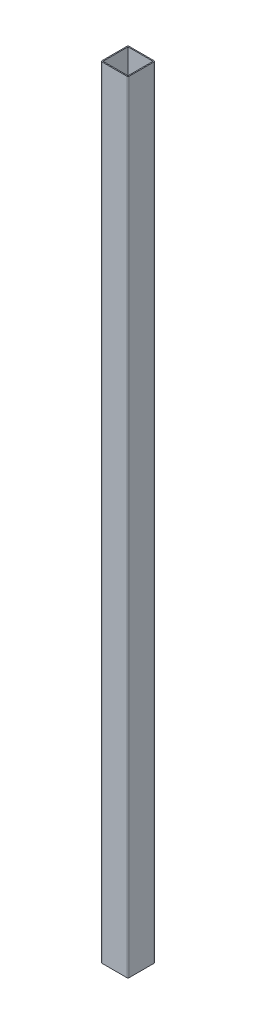
ISO-10303-21;
HEADER;
FILE_DESCRIPTION(('STEP AP214'),'2;1');
FILE_NAME('part.step','',(''),(''),'','','');
FILE_SCHEMA(('AUTOMOTIVE_DESIGN { 1 0 10303 214 1 1 1 1 }'));
ENDSEC;
DATA;
#1=APPLICATION_CONTEXT('core data for automotive mechanical design processes');
#2=APPLICATION_PROTOCOL_DEFINITION('international standard','automotive_design',2000,#1);
#3=PRODUCT_CONTEXT('',#1,'mechanical');
#4=PRODUCT('Part','Part','',(#3));
#5=PRODUCT_RELATED_PRODUCT_CATEGORY('part','',(#4));
#6=PRODUCT_DEFINITION_FORMATION('','',#4);
#7=PRODUCT_DEFINITION_CONTEXT('part definition',#1,'design');
#8=PRODUCT_DEFINITION('design','',#6,#7);
#9=PRODUCT_DEFINITION_SHAPE('','',#8);
#10=(LENGTH_UNIT() NAMED_UNIT(*) SI_UNIT(.MILLI.,.METRE.));
#11=(NAMED_UNIT(*) PLANE_ANGLE_UNIT() SI_UNIT($,.RADIAN.));
#12=(NAMED_UNIT(*) SI_UNIT($,.STERADIAN.) SOLID_ANGLE_UNIT());
#13=UNCERTAINTY_MEASURE_WITH_UNIT(LENGTH_MEASURE(1.E-05),#10,'distance_accuracy_value','');
#14=(GEOMETRIC_REPRESENTATION_CONTEXT(3) GLOBAL_UNCERTAINTY_ASSIGNED_CONTEXT((#13)) GLOBAL_UNIT_ASSIGNED_CONTEXT((#10,
#11,#12)) REPRESENTATION_CONTEXT('',''));
#15=CARTESIAN_POINT('',(0.,0.,0.));
#16=DIRECTION('',(0.,0.,1.));
#17=DIRECTION('',(1.,0.,0.));
#18=AXIS2_PLACEMENT_3D('',#15,#16,#17);
#19=CARTESIAN_POINT('',(73.9990000000006,-4614.,73.999));
#20=DIRECTION('',(0.,1.,0.));
#21=DIRECTION('',(-1.,0.,0.));
#22=AXIS2_PLACEMENT_3D('',#19,#20,#21);
#23=CYLINDRICAL_SURFACE('',#22,6.00100000000001);
#24=CARTESIAN_POINT('',(73.999,0.,73.999));
#25=DIRECTION('',(0.,-1.,0.));
#26=DIRECTION('',(1.,0.,0.));
#27=AXIS2_PLACEMENT_3D('',#24,#25,#26);
#28=CIRCLE('',#27,6.00100000000001);
#29=CARTESIAN_POINT('',(80.,0.,73.999));
#30=VERTEX_POINT('',#29);
#31=CARTESIAN_POINT('',(73.999,0.,80.));
#32=VERTEX_POINT('',#31);
#33=EDGE_CURVE('E232',#30,#32,#28,.T.);
#34=ORIENTED_EDGE('',*,*,#33,.T.);
#35=DIRECTION('',(0.,1.,0.));
#36=VECTOR('',#35,1.);
#37=CARTESIAN_POINT('',(73.9990000000006,-4614.,80.));
#38=LINE('',#37,#36);
#39=CARTESIAN_POINT('',(73.9990000000006,-4614.,80.));
#40=VERTEX_POINT('',#39);
#41=EDGE_CURVE('E12',#40,#32,#38,.T.);
#42=ORIENTED_EDGE('',*,*,#41,.F.);
#43=CARTESIAN_POINT('',(73.9990000000006,-4614.,73.999));
#44=DIRECTION('',(0.,-1.,0.));
#45=DIRECTION('',(1.,0.,0.));
#46=AXIS2_PLACEMENT_3D('',#43,#44,#45);
#47=CIRCLE('',#46,6.00100000000001);
#48=CARTESIAN_POINT('',(80.0000000000006,-4614.,73.999));
#49=VERTEX_POINT('',#48);
#50=EDGE_CURVE('E310',#49,#40,#47,.T.);
#51=ORIENTED_EDGE('',*,*,#50,.F.);
#52=DIRECTION('',(0.,1.,0.));
#53=VECTOR('',#52,1.);
#54=CARTESIAN_POINT('',(80.0000000000006,-4614.,73.999));
#55=LINE('',#54,#53);
#56=EDGE_CURVE('E247',#49,#30,#55,.T.);
#57=ORIENTED_EDGE('',*,*,#56,.T.);
#58=EDGE_LOOP('',(#34,#42,#51,#57));
#59=FACE_BOUND('',#58,.T.);
#60=ADVANCED_FACE('F60',(#59),#23,.T.);
#61=CARTESIAN_POINT('',(73.9990000000006,-4614.,80.));
#62=DIRECTION('',(0.,0.,-1.));
#63=DIRECTION('',(-1.,0.,0.));
#64=AXIS2_PLACEMENT_3D('',#61,#62,#63);
#65=PLANE('',#64);
#66=DIRECTION('',(-1.,0.,0.));
#67=VECTOR('',#66,1.);
#68=CARTESIAN_POINT('',(73.999,0.,80.));
#69=LINE('',#68,#67);
#70=CARTESIAN_POINT('',(-73.999,0.,80.));
#71=VERTEX_POINT('',#70);
#72=EDGE_CURVE('E235',#32,#71,#69,.T.);
#73=ORIENTED_EDGE('',*,*,#72,.T.);
#74=DIRECTION('',(0.,1.,0.));
#75=VECTOR('',#74,1.);
#76=CARTESIAN_POINT('',(-73.9989999999995,-4614.,80.));
#77=LINE('',#76,#75);
#78=CARTESIAN_POINT('',(-73.9989999999995,-4614.,80.));
#79=VERTEX_POINT('',#78);
#80=EDGE_CURVE('E70',#79,#71,#77,.T.);
#81=ORIENTED_EDGE('',*,*,#80,.F.);
#82=DIRECTION('',(-1.,0.,0.));
#83=VECTOR('',#82,1.);
#84=CARTESIAN_POINT('',(73.9990000000006,-4614.,80.));
#85=LINE('',#84,#83);
#86=EDGE_CURVE('E312',#40,#79,#85,.T.);
#87=ORIENTED_EDGE('',*,*,#86,.F.);
#88=ORIENTED_EDGE('',*,*,#41,.T.);
#89=EDGE_LOOP('',(#73,#81,#87,#88));
#90=FACE_BOUND('',#89,.T.);
#91=ADVANCED_FACE('F347',(#90),#65,.F.);
#92=CARTESIAN_POINT('',(-73.9989999999994,-4614.,73.999));
#93=DIRECTION('',(0.,1.,0.));
#94=DIRECTION('',(-1.,0.,0.));
#95=AXIS2_PLACEMENT_3D('',#92,#93,#94);
#96=CYLINDRICAL_SURFACE('',#95,6.00100000000001);
#97=CARTESIAN_POINT('',(-73.999,0.,73.999));
#98=DIRECTION('',(0.,-1.,0.));
#99=DIRECTION('',(1.,0.,0.));
#100=AXIS2_PLACEMENT_3D('',#97,#98,#99);
#101=CIRCLE('',#100,6.00100000000001);
#102=CARTESIAN_POINT('',(-80.,0.,73.999));
#103=VERTEX_POINT('',#102);
#104=EDGE_CURVE('E237',#71,#103,#101,.T.);
#105=ORIENTED_EDGE('',*,*,#104,.T.);
#106=DIRECTION('',(0.,1.,0.));
#107=VECTOR('',#106,1.);
#108=CARTESIAN_POINT('',(-79.9999999999994,-4614.,73.999));
#109=LINE('',#108,#107);
#110=CARTESIAN_POINT('',(-79.9999999999994,-4614.,73.999));
#111=VERTEX_POINT('',#110);
#112=EDGE_CURVE('E254',#111,#103,#109,.T.);
#113=ORIENTED_EDGE('',*,*,#112,.F.);
#114=CARTESIAN_POINT('',(-73.9989999999994,-4614.,73.999));
#115=DIRECTION('',(0.,-1.,0.));
#116=DIRECTION('',(1.,0.,0.));
#117=AXIS2_PLACEMENT_3D('',#114,#115,#116);
#118=CIRCLE('',#117,6.00100000000001);
#119=EDGE_CURVE('E314',#79,#111,#118,.T.);
#120=ORIENTED_EDGE('',*,*,#119,.F.);
#121=ORIENTED_EDGE('',*,*,#80,.T.);
#122=EDGE_LOOP('',(#105,#113,#120,#121));
#123=FACE_BOUND('',#122,.T.);
#124=ADVANCED_FACE('F352',(#123),#96,.T.);
#125=CARTESIAN_POINT('',(-79.9999999999994,-4614.,-73.999));
#126=DIRECTION('',(1.,0.,0.));
#127=DIRECTION('',(0.,1.,0.));
#128=AXIS2_PLACEMENT_3D('',#125,#126,#127);
#129=PLANE('',#128);
#130=DIRECTION('',(0.,0.,-1.));
#131=VECTOR('',#130,1.);
#132=CARTESIAN_POINT('',(-80.,0.,-73.999));
#133=LINE('',#132,#131);
#134=CARTESIAN_POINT('',(-80.,0.,-73.999));
#135=VERTEX_POINT('',#134);
#136=EDGE_CURVE('E239',#103,#135,#133,.T.);
#137=ORIENTED_EDGE('',*,*,#136,.T.);
#138=DIRECTION('',(0.,1.,0.));
#139=VECTOR('',#138,1.);
#140=CARTESIAN_POINT('',(-79.9999999999994,-4614.,-73.999));
#141=LINE('',#140,#139);
#142=CARTESIAN_POINT('',(-79.9999999999994,-4614.,-73.999));
#143=VERTEX_POINT('',#142);
#144=EDGE_CURVE('E251',#143,#135,#141,.T.);
#145=ORIENTED_EDGE('',*,*,#144,.F.);
#146=DIRECTION('',(0.,0.,-1.));
#147=VECTOR('',#146,1.);
#148=CARTESIAN_POINT('',(-79.9999999999994,-4614.,-73.999));
#149=LINE('',#148,#147);
#150=EDGE_CURVE('E316',#111,#143,#149,.T.);
#151=ORIENTED_EDGE('',*,*,#150,.F.);
#152=ORIENTED_EDGE('',*,*,#112,.T.);
#153=EDGE_LOOP('',(#137,#145,#151,#152));
#154=FACE_BOUND('',#153,.T.);
#155=ADVANCED_FACE('F322',(#154),#129,.F.);
#156=CARTESIAN_POINT('',(-73.9989999999994,-4614.,-73.999));
#157=DIRECTION('',(0.,1.,0.));
#158=DIRECTION('',(-1.,0.,0.));
#159=AXIS2_PLACEMENT_3D('',#156,#157,#158);
#160=CYLINDRICAL_SURFACE('',#159,6.001);
#161=CARTESIAN_POINT('',(-73.999,0.,-73.999));
#162=DIRECTION('',(0.,-1.,0.));
#163=DIRECTION('',(1.,0.,0.));
#164=AXIS2_PLACEMENT_3D('',#161,#162,#163);
#165=CIRCLE('',#164,6.001);
#166=CARTESIAN_POINT('',(-73.999,0.,-80.));
#167=VERTEX_POINT('',#166);
#168=EDGE_CURVE('E241',#135,#167,#165,.T.);
#169=ORIENTED_EDGE('',*,*,#168,.T.);
#170=DIRECTION('',(0.,1.,0.));
#171=VECTOR('',#170,1.);
#172=CARTESIAN_POINT('',(-73.9989999999995,-4614.,-80.));
#173=LINE('',#172,#171);
#174=CARTESIAN_POINT('',(-73.9989999999995,-4614.,-80.));
#175=VERTEX_POINT('',#174);
#176=EDGE_CURVE('E199',#175,#167,#173,.T.);
#177=ORIENTED_EDGE('',*,*,#176,.F.);
#178=CARTESIAN_POINT('',(-73.9989999999994,-4614.,-73.999));
#179=DIRECTION('',(0.,-1.,0.));
#180=DIRECTION('',(1.,0.,0.));
#181=AXIS2_PLACEMENT_3D('',#178,#179,#180);
#182=CIRCLE('',#181,6.001);
#183=EDGE_CURVE('E190',#143,#175,#182,.T.);
#184=ORIENTED_EDGE('',*,*,#183,.F.);
#185=ORIENTED_EDGE('',*,*,#144,.T.);
#186=EDGE_LOOP('',(#169,#177,#184,#185));
#187=FACE_BOUND('',#186,.T.);
#188=ADVANCED_FACE('F326',(#187),#160,.T.);
#189=CARTESIAN_POINT('',(-73.9989999999995,-4614.,-80.));
#190=DIRECTION('',(0.,0.,1.));
#191=DIRECTION('',(1.,0.,0.));
#192=AXIS2_PLACEMENT_3D('',#189,#190,#191);
#193=PLANE('',#192);
#194=DIRECTION('',(1.,0.,0.));
#195=VECTOR('',#194,1.);
#196=CARTESIAN_POINT('',(-73.999,0.,-80.));
#197=LINE('',#196,#195);
#198=CARTESIAN_POINT('',(73.999,0.,-80.));
#199=VERTEX_POINT('',#198);
#200=EDGE_CURVE('E198',#167,#199,#197,.T.);
#201=ORIENTED_EDGE('',*,*,#200,.T.);
#202=DIRECTION('',(0.,1.,0.));
#203=VECTOR('',#202,1.);
#204=CARTESIAN_POINT('',(73.9990000000006,-4614.,-80.));
#205=LINE('',#204,#203);
#206=CARTESIAN_POINT('',(73.9990000000006,-4614.,-80.));
#207=VERTEX_POINT('',#206);
#208=EDGE_CURVE('E195',#207,#199,#205,.T.);
#209=ORIENTED_EDGE('',*,*,#208,.F.);
#210=DIRECTION('',(1.,0.,0.));
#211=VECTOR('',#210,1.);
#212=CARTESIAN_POINT('',(-73.9989999999995,-4614.,-80.));
#213=LINE('',#212,#211);
#214=EDGE_CURVE('E184',#175,#207,#213,.T.);
#215=ORIENTED_EDGE('',*,*,#214,.F.);
#216=ORIENTED_EDGE('',*,*,#176,.T.);
#217=EDGE_LOOP('',(#201,#209,#215,#216));
#218=FACE_BOUND('',#217,.T.);
#219=ADVANCED_FACE('F196',(#218),#193,.F.);
#220=CARTESIAN_POINT('',(73.9990000000006,-4614.,-73.999));
#221=DIRECTION('',(0.,1.,0.));
#222=DIRECTION('',(-1.,0.,0.));
#223=AXIS2_PLACEMENT_3D('',#220,#221,#222);
#224=CYLINDRICAL_SURFACE('',#223,6.001);
#225=CARTESIAN_POINT('',(73.999,0.,-73.999));
#226=DIRECTION('',(0.,-1.,0.));
#227=DIRECTION('',(1.,0.,0.));
#228=AXIS2_PLACEMENT_3D('',#225,#226,#227);
#229=CIRCLE('',#228,6.001);
#230=CARTESIAN_POINT('',(80.,0.,-73.999));
#231=VERTEX_POINT('',#230);
#232=EDGE_CURVE('E132',#199,#231,#229,.T.);
#233=ORIENTED_EDGE('',*,*,#232,.T.);
#234=DIRECTION('',(0.,1.,0.));
#235=VECTOR('',#234,1.);
#236=CARTESIAN_POINT('',(80.0000000000006,-4614.,-73.999));
#237=LINE('',#236,#235);
#238=CARTESIAN_POINT('',(80.0000000000006,-4614.,-73.999));
#239=VERTEX_POINT('',#238);
#240=EDGE_CURVE('E200',#239,#231,#237,.T.);
#241=ORIENTED_EDGE('',*,*,#240,.F.);
#242=CARTESIAN_POINT('',(73.9990000000006,-4614.,-73.999));
#243=DIRECTION('',(0.,-1.,0.));
#244=DIRECTION('',(1.,0.,0.));
#245=AXIS2_PLACEMENT_3D('',#242,#243,#244);
#246=CIRCLE('',#245,6.001);
#247=EDGE_CURVE('E188',#207,#239,#246,.T.);
#248=ORIENTED_EDGE('',*,*,#247,.F.);
#249=ORIENTED_EDGE('',*,*,#208,.T.);
#250=EDGE_LOOP('',(#233,#241,#248,#249));
#251=FACE_BOUND('',#250,.T.);
#252=ADVANCED_FACE('F202',(#251),#224,.T.);
#253=CARTESIAN_POINT('',(-73.9989999999994,-4614.,73.999));
#254=DIRECTION('',(0.,1.,0.));
#255=DIRECTION('',(-1.,0.,0.));
#256=AXIS2_PLACEMENT_3D('',#253,#254,#255);
#257=CYLINDRICAL_SURFACE('',#256,0.000999999999987122);
#258=CARTESIAN_POINT('',(-73.999,0.,73.999));
#259=DIRECTION('',(0.,-1.,0.));
#260=DIRECTION('',(1.,0.,0.));
#261=AXIS2_PLACEMENT_3D('',#258,#259,#260);
#262=CIRCLE('',#261,0.000999999999987122);
#263=CARTESIAN_POINT('',(-73.999,0.,74.));
#264=VERTEX_POINT('',#263);
#265=CARTESIAN_POINT('',(-74.,0.,73.999));
#266=VERTEX_POINT('',#265);
#267=EDGE_CURVE('E208',#264,#266,#262,.T.);
#268=ORIENTED_EDGE('',*,*,#267,.F.);
#269=DIRECTION('',(0.,1.,0.));
#270=VECTOR('',#269,1.);
#271=CARTESIAN_POINT('',(-73.9989999999994,-4614.,74.));
#272=LINE('',#271,#270);
#273=CARTESIAN_POINT('',(-73.9989999999994,-4614.,74.));
#274=VERTEX_POINT('',#273);
#275=EDGE_CURVE('E64',#274,#264,#272,.T.);
#276=ORIENTED_EDGE('',*,*,#275,.F.);
#277=CARTESIAN_POINT('',(-73.9989999999994,-4614.,73.999));
#278=DIRECTION('',(0.,-1.,0.));
#279=DIRECTION('',(1.,0.,0.));
#280=AXIS2_PLACEMENT_3D('',#277,#278,#279);
#281=CIRCLE('',#280,0.000999999999987122);
#282=CARTESIAN_POINT('',(-73.9999999999994,-4614.,73.999));
#283=VERTEX_POINT('',#282);
#284=EDGE_CURVE('E246',#274,#283,#281,.T.);
#285=ORIENTED_EDGE('',*,*,#284,.T.);
#286=DIRECTION('',(0.,1.,0.));
#287=VECTOR('',#286,1.);
#288=CARTESIAN_POINT('',(-73.9999999999994,-4614.,73.999));
#289=LINE('',#288,#287);
#290=EDGE_CURVE('E204',#283,#266,#289,.T.);
#291=ORIENTED_EDGE('',*,*,#290,.T.);
#292=EDGE_LOOP('',(#268,#276,#285,#291));
#293=FACE_BOUND('',#292,.T.);
#294=ADVANCED_FACE('F62',(#293),#257,.F.);
#295=CARTESIAN_POINT('',(73.9990000000006,-4614.,74.));
#296=DIRECTION('',(0.,0.,-1.));
#297=DIRECTION('',(-1.,0.,0.));
#298=AXIS2_PLACEMENT_3D('',#295,#296,#297);
#299=PLANE('',#298);
#300=DIRECTION('',(-1.,0.,0.));
#301=VECTOR('',#300,1.);
#302=CARTESIAN_POINT('',(73.999,0.,74.));
#303=LINE('',#302,#301);
#304=CARTESIAN_POINT('',(73.999,0.,74.));
#305=VERTEX_POINT('',#304);
#306=EDGE_CURVE('E211',#305,#264,#303,.T.);
#307=ORIENTED_EDGE('',*,*,#306,.F.);
#308=DIRECTION('',(0.,1.,0.));
#309=VECTOR('',#308,1.);
#310=CARTESIAN_POINT('',(73.9990000000006,-4614.,74.));
#311=LINE('',#310,#309);
#312=CARTESIAN_POINT('',(73.9990000000006,-4614.,74.));
#313=VERTEX_POINT('',#312);
#314=EDGE_CURVE('E269',#313,#305,#311,.T.);
#315=ORIENTED_EDGE('',*,*,#314,.F.);
#316=DIRECTION('',(-1.,0.,0.));
#317=VECTOR('',#316,1.);
#318=CARTESIAN_POINT('',(73.9990000000006,-4614.,74.));
#319=LINE('',#318,#317);
#320=EDGE_CURVE('E278',#313,#274,#319,.T.);
#321=ORIENTED_EDGE('',*,*,#320,.T.);
#322=ORIENTED_EDGE('',*,*,#275,.T.);
#323=EDGE_LOOP('',(#307,#315,#321,#322));
#324=FACE_BOUND('',#323,.T.);
#325=ADVANCED_FACE('F276',(#324),#299,.T.);
#326=CARTESIAN_POINT('',(73.9990000000006,-4614.,73.999));
#327=DIRECTION('',(0.,1.,0.));
#328=DIRECTION('',(-1.,0.,0.));
#329=AXIS2_PLACEMENT_3D('',#326,#327,#328);
#330=CYLINDRICAL_SURFACE('',#329,0.000999999999987122);
#331=CARTESIAN_POINT('',(73.999,0.,73.999));
#332=DIRECTION('',(0.,-1.,0.));
#333=DIRECTION('',(1.,0.,0.));
#334=AXIS2_PLACEMENT_3D('',#331,#332,#333);
#335=CIRCLE('',#334,0.000999999999987122);
#336=CARTESIAN_POINT('',(74.,0.,73.999));
#337=VERTEX_POINT('',#336);
#338=EDGE_CURVE('E214',#337,#305,#335,.T.);
#339=ORIENTED_EDGE('',*,*,#338,.F.);
#340=DIRECTION('',(0.,1.,0.));
#341=VECTOR('',#340,1.);
#342=CARTESIAN_POINT('',(74.0000000000006,-4614.,73.999));
#343=LINE('',#342,#341);
#344=CARTESIAN_POINT('',(74.0000000000006,-4614.,73.999));
#345=VERTEX_POINT('',#344);
#346=EDGE_CURVE('E268',#345,#337,#343,.T.);
#347=ORIENTED_EDGE('',*,*,#346,.F.);
#348=CARTESIAN_POINT('',(73.9990000000006,-4614.,73.999));
#349=DIRECTION('',(0.,-1.,0.));
#350=DIRECTION('',(1.,0.,0.));
#351=AXIS2_PLACEMENT_3D('',#348,#349,#350);
#352=CIRCLE('',#351,0.000999999999987122);
#353=EDGE_CURVE('E286',#345,#313,#352,.T.);
#354=ORIENTED_EDGE('',*,*,#353,.T.);
#355=ORIENTED_EDGE('',*,*,#314,.T.);
#356=EDGE_LOOP('',(#339,#347,#354,#355));
#357=FACE_BOUND('',#356,.T.);
#358=ADVANCED_FACE('F284',(#357),#330,.F.);
#359=CARTESIAN_POINT('',(74.0000000000006,-4614.,73.999));
#360=DIRECTION('',(-1.,0.,0.));
#361=DIRECTION('',(0.,-1.,0.));
#362=AXIS2_PLACEMENT_3D('',#359,#360,#361);
#363=PLANE('',#362);
#364=DIRECTION('',(0.,0.,1.));
#365=VECTOR('',#364,1.);
#366=CARTESIAN_POINT('',(74.,0.,73.999));
#367=LINE('',#366,#365);
#368=CARTESIAN_POINT('',(74.,0.,-73.999));
#369=VERTEX_POINT('',#368);
#370=EDGE_CURVE('E217',#369,#337,#367,.T.);
#371=ORIENTED_EDGE('',*,*,#370,.F.);
#372=DIRECTION('',(0.,1.,0.));
#373=VECTOR('',#372,1.);
#374=CARTESIAN_POINT('',(74.0000000000006,-4614.,-73.999));
#375=LINE('',#374,#373);
#376=CARTESIAN_POINT('',(74.0000000000006,-4614.,-73.999));
#377=VERTEX_POINT('',#376);
#378=EDGE_CURVE('E266',#377,#369,#375,.T.);
#379=ORIENTED_EDGE('',*,*,#378,.F.);
#380=DIRECTION('',(0.,0.,1.));
#381=VECTOR('',#380,1.);
#382=CARTESIAN_POINT('',(74.0000000000006,-4614.,73.999));
#383=LINE('',#382,#381);
#384=EDGE_CURVE('E292',#377,#345,#383,.T.);
#385=ORIENTED_EDGE('',*,*,#384,.T.);
#386=ORIENTED_EDGE('',*,*,#346,.T.);
#387=EDGE_LOOP('',(#371,#379,#385,#386));
#388=FACE_BOUND('',#387,.T.);
#389=ADVANCED_FACE('F295',(#388),#363,.T.);
#390=CARTESIAN_POINT('',(73.9990000000006,-4614.,-73.999));
#391=DIRECTION('',(0.,1.,0.));
#392=DIRECTION('',(-1.,0.,0.));
#393=AXIS2_PLACEMENT_3D('',#390,#391,#392);
#394=CYLINDRICAL_SURFACE('',#393,0.000999999999980183);
#395=CARTESIAN_POINT('',(73.999,0.,-73.999));
#396=DIRECTION('',(0.,-1.,0.));
#397=DIRECTION('',(1.,0.,0.));
#398=AXIS2_PLACEMENT_3D('',#395,#396,#397);
#399=CIRCLE('',#398,0.000999999999980183);
#400=CARTESIAN_POINT('',(73.999,0.,-74.));
#401=VERTEX_POINT('',#400);
#402=EDGE_CURVE('E220',#401,#369,#399,.T.);
#403=ORIENTED_EDGE('',*,*,#402,.F.);
#404=DIRECTION('',(0.,1.,0.));
#405=VECTOR('',#404,1.);
#406=CARTESIAN_POINT('',(73.9990000000006,-4614.,-74.));
#407=LINE('',#406,#405);
#408=CARTESIAN_POINT('',(73.9990000000006,-4614.,-74.));
#409=VERTEX_POINT('',#408);
#410=EDGE_CURVE('E264',#409,#401,#407,.T.);
#411=ORIENTED_EDGE('',*,*,#410,.F.);
#412=CARTESIAN_POINT('',(73.9990000000006,-4614.,-73.999));
#413=DIRECTION('',(0.,-1.,0.));
#414=DIRECTION('',(1.,0.,0.));
#415=AXIS2_PLACEMENT_3D('',#412,#413,#414);
#416=CIRCLE('',#415,0.000999999999980183);
#417=EDGE_CURVE('E296',#409,#377,#416,.T.);
#418=ORIENTED_EDGE('',*,*,#417,.T.);
#419=ORIENTED_EDGE('',*,*,#378,.T.);
#420=EDGE_LOOP('',(#403,#411,#418,#419));
#421=FACE_BOUND('',#420,.T.);
#422=ADVANCED_FACE('F363',(#421),#394,.F.);
#423=CARTESIAN_POINT('',(-73.9989999999994,-4614.,-74.));
#424=DIRECTION('',(0.,0.,1.));
#425=DIRECTION('',(1.,0.,0.));
#426=AXIS2_PLACEMENT_3D('',#423,#424,#425);
#427=PLANE('',#426);
#428=DIRECTION('',(1.,0.,0.));
#429=VECTOR('',#428,1.);
#430=CARTESIAN_POINT('',(-73.999,0.,-74.));
#431=LINE('',#430,#429);
#432=CARTESIAN_POINT('',(-73.999,0.,-74.));
#433=VERTEX_POINT('',#432);
#434=EDGE_CURVE('E223',#433,#401,#431,.T.);
#435=ORIENTED_EDGE('',*,*,#434,.F.);
#436=DIRECTION('',(0.,1.,0.));
#437=VECTOR('',#436,1.);
#438=CARTESIAN_POINT('',(-73.9989999999994,-4614.,-74.));
#439=LINE('',#438,#437);
#440=CARTESIAN_POINT('',(-73.9989999999994,-4614.,-74.));
#441=VERTEX_POINT('',#440);
#442=EDGE_CURVE('E262',#441,#433,#439,.T.);
#443=ORIENTED_EDGE('',*,*,#442,.F.);
#444=DIRECTION('',(1.,0.,0.));
#445=VECTOR('',#444,1.);
#446=CARTESIAN_POINT('',(-73.9989999999994,-4614.,-74.));
#447=LINE('',#446,#445);
#448=EDGE_CURVE('E298',#441,#409,#447,.T.);
#449=ORIENTED_EDGE('',*,*,#448,.T.);
#450=ORIENTED_EDGE('',*,*,#410,.T.);
#451=EDGE_LOOP('',(#435,#443,#449,#450));
#452=FACE_BOUND('',#451,.T.);
#453=ADVANCED_FACE('F359',(#452),#427,.T.);
#454=CARTESIAN_POINT('',(-73.9989999999994,-4614.,-73.999));
#455=DIRECTION('',(0.,1.,0.));
#456=DIRECTION('',(-1.,0.,0.));
#457=AXIS2_PLACEMENT_3D('',#454,#455,#456);
#458=CYLINDRICAL_SURFACE('',#457,0.000999999999980183);
#459=CARTESIAN_POINT('',(-73.999,0.,-73.999));
#460=DIRECTION('',(0.,-1.,0.));
#461=DIRECTION('',(1.,0.,0.));
#462=AXIS2_PLACEMENT_3D('',#459,#460,#461);
#463=CIRCLE('',#462,0.000999999999980183);
#464=CARTESIAN_POINT('',(-74.,0.,-73.999));
#465=VERTEX_POINT('',#464);
#466=EDGE_CURVE('E226',#465,#433,#463,.T.);
#467=ORIENTED_EDGE('',*,*,#466,.F.);
#468=DIRECTION('',(0.,1.,0.));
#469=VECTOR('',#468,1.);
#470=CARTESIAN_POINT('',(-73.9999999999994,-4614.,-73.999));
#471=LINE('',#470,#469);
#472=CARTESIAN_POINT('',(-73.9999999999994,-4614.,-73.999));
#473=VERTEX_POINT('',#472);
#474=EDGE_CURVE('E260',#473,#465,#471,.T.);
#475=ORIENTED_EDGE('',*,*,#474,.F.);
#476=CARTESIAN_POINT('',(-73.9989999999994,-4614.,-73.999));
#477=DIRECTION('',(0.,-1.,0.));
#478=DIRECTION('',(1.,0.,0.));
#479=AXIS2_PLACEMENT_3D('',#476,#477,#478);
#480=CIRCLE('',#479,0.000999999999980183);
#481=EDGE_CURVE('E304',#473,#441,#480,.T.);
#482=ORIENTED_EDGE('',*,*,#481,.T.);
#483=ORIENTED_EDGE('',*,*,#442,.T.);
#484=EDGE_LOOP('',(#467,#475,#482,#483));
#485=FACE_BOUND('',#484,.T.);
#486=ADVANCED_FACE('F341',(#485),#458,.F.);
#487=CARTESIAN_POINT('',(-73.9999999999994,-4614.,-73.999));
#488=DIRECTION('',(1.,0.,0.));
#489=DIRECTION('',(0.,1.,0.));
#490=AXIS2_PLACEMENT_3D('',#487,#488,#489);
#491=PLANE('',#490);
#492=DIRECTION('',(0.,0.,-1.));
#493=VECTOR('',#492,1.);
#494=CARTESIAN_POINT('',(-74.,0.,-73.999));
#495=LINE('',#494,#493);
#496=EDGE_CURVE('E229',#266,#465,#495,.T.);
#497=ORIENTED_EDGE('',*,*,#496,.F.);
#498=ORIENTED_EDGE('',*,*,#290,.F.);
#499=DIRECTION('',(0.,0.,-1.));
#500=VECTOR('',#499,1.);
#501=CARTESIAN_POINT('',(-73.9999999999994,-4614.,-73.999));
#502=LINE('',#501,#500);
#503=EDGE_CURVE('E307',#283,#473,#502,.T.);
#504=ORIENTED_EDGE('',*,*,#503,.T.);
#505=ORIENTED_EDGE('',*,*,#474,.T.);
#506=EDGE_LOOP('',(#497,#498,#504,#505));
#507=FACE_BOUND('',#506,.T.);
#508=ADVANCED_FACE('F334',(#507),#491,.T.);
#509=CARTESIAN_POINT('',(80.0000000000006,-4614.,73.999));
#510=DIRECTION('',(-1.,0.,0.));
#511=DIRECTION('',(0.,-1.,0.));
#512=AXIS2_PLACEMENT_3D('',#509,#510,#511);
#513=PLANE('',#512);
#514=DIRECTION('',(0.,0.,1.));
#515=VECTOR('',#514,1.);
#516=CARTESIAN_POINT('',(80.,0.,73.999));
#517=LINE('',#516,#515);
#518=EDGE_CURVE('E138',#231,#30,#517,.T.);
#519=ORIENTED_EDGE('',*,*,#518,.T.);
#520=ORIENTED_EDGE('',*,*,#56,.F.);
#521=DIRECTION('',(0.,0.,1.));
#522=VECTOR('',#521,1.);
#523=CARTESIAN_POINT('',(80.0000000000006,-4614.,73.999));
#524=LINE('',#523,#522);
#525=EDGE_CURVE('E79',#239,#49,#524,.T.);
#526=ORIENTED_EDGE('',*,*,#525,.F.);
#527=ORIENTED_EDGE('',*,*,#240,.T.);
#528=EDGE_LOOP('',(#519,#520,#526,#527));
#529=FACE_BOUND('',#528,.T.);
#530=ADVANCED_FACE('F332',(#529),#513,.F.);
#531=CARTESIAN_POINT('',(73.9990000000006,-4614.,73.999));
#532=DIRECTION('',(0.,-1.,0.));
#533=DIRECTION('',(1.,0.,0.));
#534=AXIS2_PLACEMENT_3D('',#531,#532,#533);
#535=PLANE('',#534);
#536=ORIENTED_EDGE('',*,*,#284,.F.);
#537=ORIENTED_EDGE('',*,*,#320,.F.);
#538=ORIENTED_EDGE('',*,*,#353,.F.);
#539=ORIENTED_EDGE('',*,*,#384,.F.);
#540=ORIENTED_EDGE('',*,*,#417,.F.);
#541=ORIENTED_EDGE('',*,*,#448,.F.);
#542=ORIENTED_EDGE('',*,*,#481,.F.);
#543=ORIENTED_EDGE('',*,*,#503,.F.);
#544=EDGE_LOOP('',(#536,#537,#538,#539,#540,#541,#542,#543));
#545=FACE_BOUND('',#544,.T.);
#546=ORIENTED_EDGE('',*,*,#50,.T.);
#547=ORIENTED_EDGE('',*,*,#86,.T.);
#548=ORIENTED_EDGE('',*,*,#119,.T.);
#549=ORIENTED_EDGE('',*,*,#150,.T.);
#550=ORIENTED_EDGE('',*,*,#183,.T.);
#551=ORIENTED_EDGE('',*,*,#214,.T.);
#552=ORIENTED_EDGE('',*,*,#247,.T.);
#553=ORIENTED_EDGE('',*,*,#525,.T.);
#554=EDGE_LOOP('',(#546,#547,#548,#549,#550,#551,#552,#553));
#555=FACE_BOUND('',#554,.T.);
#556=ADVANCED_FACE('F186',(#545,#555),#535,.T.);
#557=CARTESIAN_POINT('',(73.999,0.,73.999));
#558=DIRECTION('',(0.,-1.,0.));
#559=DIRECTION('',(1.,0.,0.));
#560=AXIS2_PLACEMENT_3D('',#557,#558,#559);
#561=PLANE('',#560);
#562=ORIENTED_EDGE('',*,*,#267,.T.);
#563=ORIENTED_EDGE('',*,*,#496,.T.);
#564=ORIENTED_EDGE('',*,*,#466,.T.);
#565=ORIENTED_EDGE('',*,*,#434,.T.);
#566=ORIENTED_EDGE('',*,*,#402,.T.);
#567=ORIENTED_EDGE('',*,*,#370,.T.);
#568=ORIENTED_EDGE('',*,*,#338,.T.);
#569=ORIENTED_EDGE('',*,*,#306,.T.);
#570=EDGE_LOOP('',(#562,#563,#564,#565,#566,#567,#568,#569));
#571=FACE_BOUND('',#570,.T.);
#572=ORIENTED_EDGE('',*,*,#33,.F.);
#573=ORIENTED_EDGE('',*,*,#518,.F.);
#574=ORIENTED_EDGE('',*,*,#232,.F.);
#575=ORIENTED_EDGE('',*,*,#200,.F.);
#576=ORIENTED_EDGE('',*,*,#168,.F.);
#577=ORIENTED_EDGE('',*,*,#136,.F.);
#578=ORIENTED_EDGE('',*,*,#104,.F.);
#579=ORIENTED_EDGE('',*,*,#72,.F.);
#580=EDGE_LOOP('',(#572,#573,#574,#575,#576,#577,#578,#579));
#581=FACE_BOUND('',#580,.T.);
#582=ADVANCED_FACE('F281',(#571,#581),#561,.F.);
#583=CLOSED_SHELL('',(#60,#91,#124,#155,#188,#219,#252,#294,#325,#358,#389,#422,#453,#486,#508,
#530,#556,#582));
#584=MANIFOLD_SOLID_BREP('B2',#583);
#585=ADVANCED_BREP_SHAPE_REPRESENTATION('',(#18,#584),#14);
#586=SHAPE_DEFINITION_REPRESENTATION(#9,#585);
ENDSEC;
END-ISO-10303-21;
